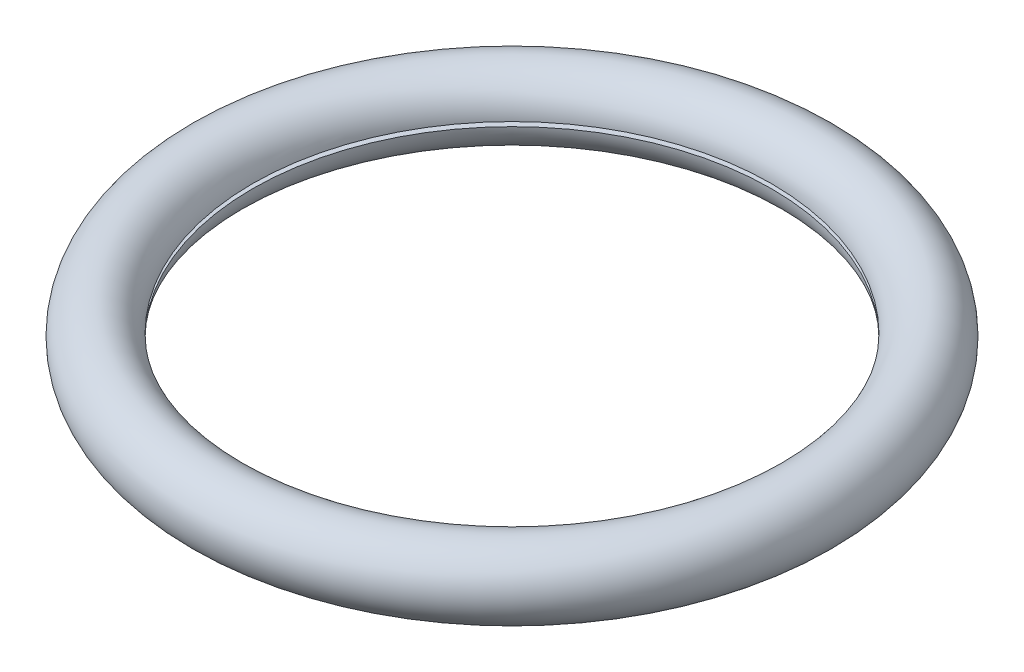
ISO-10303-21;
HEADER;
FILE_DESCRIPTION(('STEP AP214'),'2;1');
FILE_NAME('part.step','',(''),(''),'','','');
FILE_SCHEMA(('AUTOMOTIVE_DESIGN { 1 0 10303 214 1 1 1 1 }'));
ENDSEC;
DATA;
#1=APPLICATION_CONTEXT('core data for automotive mechanical design processes');
#2=APPLICATION_PROTOCOL_DEFINITION('international standard','automotive_design',2000,#1);
#3=PRODUCT_CONTEXT('',#1,'mechanical');
#4=PRODUCT('Part','Part','',(#3));
#5=PRODUCT_RELATED_PRODUCT_CATEGORY('part','',(#4));
#6=PRODUCT_DEFINITION_FORMATION('','',#4);
#7=PRODUCT_DEFINITION_CONTEXT('part definition',#1,'design');
#8=PRODUCT_DEFINITION('design','',#6,#7);
#9=PRODUCT_DEFINITION_SHAPE('','',#8);
#10=(LENGTH_UNIT() NAMED_UNIT(*) SI_UNIT(.MILLI.,.METRE.));
#11=(NAMED_UNIT(*) PLANE_ANGLE_UNIT() SI_UNIT($,.RADIAN.));
#12=(NAMED_UNIT(*) SI_UNIT($,.STERADIAN.) SOLID_ANGLE_UNIT());
#13=UNCERTAINTY_MEASURE_WITH_UNIT(LENGTH_MEASURE(1.E-05),#10,'distance_accuracy_value','');
#14=(GEOMETRIC_REPRESENTATION_CONTEXT(3) GLOBAL_UNCERTAINTY_ASSIGNED_CONTEXT((#13)) GLOBAL_UNIT_ASSIGNED_CONTEXT((#10,
#11,#12)) REPRESENTATION_CONTEXT('',''));
#15=CARTESIAN_POINT('',(0.,0.,0.));
#16=DIRECTION('',(0.,0.,1.));
#17=DIRECTION('',(1.,0.,0.));
#18=AXIS2_PLACEMENT_3D('',#15,#16,#17);
#19=CARTESIAN_POINT('',(0.,-3.6465801052463,0.));
#20=DIRECTION('',(0.,1.,0.));
#21=DIRECTION('',(0.,0.,1.));
#22=AXIS2_PLACEMENT_3D('',#19,#20,#21);
#23=TOROIDAL_SURFACE('',#22,170.688,6.34999999999999);
#24=CARTESIAN_POINT('',(0.,-4.9165801052463,0.));
#25=DIRECTION('',(0.,1.,0.));
#26=DIRECTION('',(0.,0.,1.));
#27=AXIS2_PLACEMENT_3D('',#24,#25,#26);
#28=CIRCLE('',#27,164.466296053331);
#29=CARTESIAN_POINT('',(0.,-4.9165801052463,164.466296053331));
#30=VERTEX_POINT('',#29);
#31=EDGE_CURVE('E10',#30,#30,#28,.T.);
#32=ORIENTED_EDGE('',*,*,#31,.F.);
#33=EDGE_LOOP('',(#32));
#34=FACE_BOUND('',#33,.T.);
#35=CARTESIAN_POINT('',(0.,-2.3765801052463,0.));
#36=DIRECTION('',(0.,1.,0.));
#37=DIRECTION('',(0.,0.,1.));
#38=AXIS2_PLACEMENT_3D('',#35,#36,#37);
#39=CIRCLE('',#38,164.466296053331);
#40=CARTESIAN_POINT('',(0.,-2.3765801052463,164.466296053331));
#41=VERTEX_POINT('',#40);
#42=EDGE_CURVE('E53',#41,#41,#39,.T.);
#43=ORIENTED_EDGE('',*,*,#42,.T.);
#44=EDGE_LOOP('',(#43));
#45=FACE_BOUND('',#44,.T.);
#46=ADVANCED_FACE('F39',(#34,#45),#23,.F.);
#47=CARTESIAN_POINT('',(164.466296053331,-4.9165801052463,0.));
#48=DIRECTION('',(0.,-1.,0.));
#49=DIRECTION('',(0.,0.,-1.));
#50=AXIS2_PLACEMENT_3D('',#47,#48,#49);
#51=PLANE('',#50);
#52=CARTESIAN_POINT('',(0.,-4.91658010524629,0.));
#53=DIRECTION('',(0.,1.,0.));
#54=DIRECTION('',(0.,0.,1.));
#55=AXIS2_PLACEMENT_3D('',#52,#53,#54);
#56=CIRCLE('',#55,150.407726333207);
#57=CARTESIAN_POINT('',(0.,-4.91658010524629,150.407726333207));
#58=VERTEX_POINT('',#57);
#59=EDGE_CURVE('E45',#58,#58,#56,.T.);
#60=ORIENTED_EDGE('',*,*,#59,.F.);
#61=EDGE_LOOP('',(#60));
#62=FACE_BOUND('',#61,.T.);
#63=ORIENTED_EDGE('',*,*,#31,.T.);
#64=EDGE_LOOP('',(#63));
#65=FACE_BOUND('',#64,.T.);
#66=ADVANCED_FACE('F68',(#62,#65),#51,.F.);
#67=CARTESIAN_POINT('',(0.,-3.6465801052463,0.));
#68=DIRECTION('',(0.,1.,0.));
#69=DIRECTION('',(0.,0.,1.));
#70=AXIS2_PLACEMENT_3D('',#67,#68,#69);
#71=TOROIDAL_SURFACE('',#70,170.688,20.32);
#72=CARTESIAN_POINT('',(0.,-2.3765801052463,0.));
#73=DIRECTION('',(0.,1.,0.));
#74=DIRECTION('',(0.,0.,1.));
#75=AXIS2_PLACEMENT_3D('',#72,#73,#74);
#76=CIRCLE('',#75,150.407726333207);
#77=CARTESIAN_POINT('',(0.,-2.3765801052463,150.407726333207));
#78=VERTEX_POINT('',#77);
#79=EDGE_CURVE('E49',#78,#78,#76,.T.);
#80=ORIENTED_EDGE('',*,*,#79,.F.);
#81=EDGE_LOOP('',(#80));
#82=FACE_BOUND('',#81,.T.);
#83=ORIENTED_EDGE('',*,*,#59,.T.);
#84=EDGE_LOOP('',(#83));
#85=FACE_BOUND('',#84,.T.);
#86=ADVANCED_FACE('F63',(#82,#85),#71,.T.);
#87=CARTESIAN_POINT('',(164.466296053331,-2.3765801052463,0.));
#88=DIRECTION('',(0.,1.,0.));
#89=DIRECTION('',(0.,0.,1.));
#90=AXIS2_PLACEMENT_3D('',#87,#88,#89);
#91=PLANE('',#90);
#92=ORIENTED_EDGE('',*,*,#42,.F.);
#93=EDGE_LOOP('',(#92));
#94=FACE_BOUND('',#93,.T.);
#95=ORIENTED_EDGE('',*,*,#79,.T.);
#96=EDGE_LOOP('',(#95));
#97=FACE_BOUND('',#96,.T.);
#98=ADVANCED_FACE('F60',(#94,#97),#91,.F.);
#99=CLOSED_SHELL('',(#46,#66,#86,#98));
#100=MANIFOLD_SOLID_BREP('B2',#99);
#101=ADVANCED_BREP_SHAPE_REPRESENTATION('',(#18,#100),#14);
#102=SHAPE_DEFINITION_REPRESENTATION(#9,#101);
ENDSEC;
END-ISO-10303-21;
